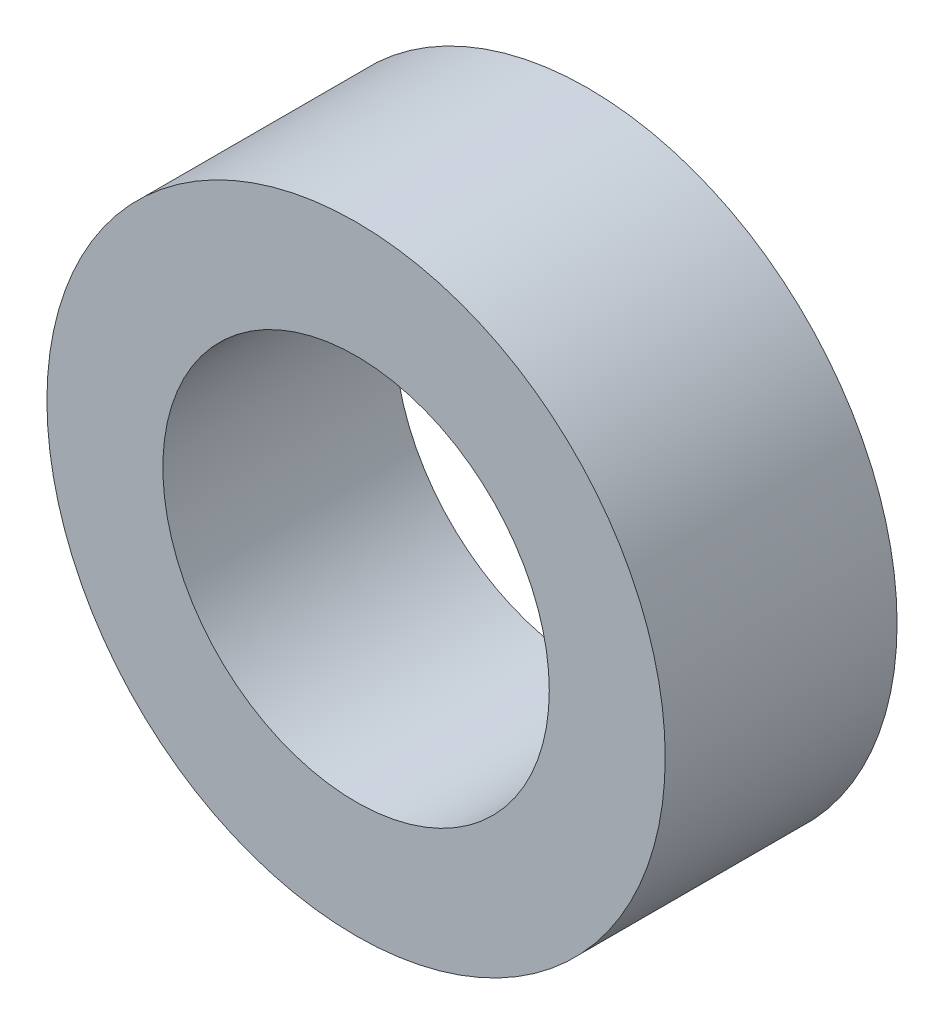
ISO-10303-21;
HEADER;
FILE_DESCRIPTION(('STEP AP214'),'2;1');
FILE_NAME('part.step','',(''),(''),'','','');
FILE_SCHEMA(('AUTOMOTIVE_DESIGN { 1 0 10303 214 1 1 1 1 }'));
ENDSEC;
DATA;
#1=APPLICATION_CONTEXT('core data for automotive mechanical design processes');
#2=APPLICATION_PROTOCOL_DEFINITION('international standard','automotive_design',2000,#1);
#3=PRODUCT_CONTEXT('',#1,'mechanical');
#4=PRODUCT('Part','Part','',(#3));
#5=PRODUCT_RELATED_PRODUCT_CATEGORY('part','',(#4));
#6=PRODUCT_DEFINITION_FORMATION('','',#4);
#7=PRODUCT_DEFINITION_CONTEXT('part definition',#1,'design');
#8=PRODUCT_DEFINITION('design','',#6,#7);
#9=PRODUCT_DEFINITION_SHAPE('','',#8);
#10=(LENGTH_UNIT() NAMED_UNIT(*) SI_UNIT(.MILLI.,.METRE.));
#11=(NAMED_UNIT(*) PLANE_ANGLE_UNIT() SI_UNIT($,.RADIAN.));
#12=(NAMED_UNIT(*) SI_UNIT($,.STERADIAN.) SOLID_ANGLE_UNIT());
#13=UNCERTAINTY_MEASURE_WITH_UNIT(LENGTH_MEASURE(1.E-05),#10,'distance_accuracy_value','');
#14=(GEOMETRIC_REPRESENTATION_CONTEXT(3) GLOBAL_UNCERTAINTY_ASSIGNED_CONTEXT((#13)) GLOBAL_UNIT_ASSIGNED_CONTEXT((#10,
#11,#12)) REPRESENTATION_CONTEXT('',''));
#15=CARTESIAN_POINT('',(0.,0.,0.));
#16=DIRECTION('',(0.,0.,1.));
#17=DIRECTION('',(1.,0.,0.));
#18=AXIS2_PLACEMENT_3D('',#15,#16,#17);
#19=CARTESIAN_POINT('',(0.,0.,6.));
#20=DIRECTION('',(0.,0.,1.));
#21=DIRECTION('',(1.,0.,0.));
#22=AXIS2_PLACEMENT_3D('',#19,#20,#21);
#23=PLANE('',#22);
#24=CARTESIAN_POINT('',(0.,0.,6.));
#25=DIRECTION('',(0.,0.,1.));
#26=DIRECTION('',(1.,0.,0.));
#27=AXIS2_PLACEMENT_3D('',#24,#25,#26);
#28=CIRCLE('',#27,8.);
#29=CARTESIAN_POINT('',(8.,0.,6.));
#30=VERTEX_POINT('',#29);
#31=EDGE_CURVE('E10',#30,#30,#28,.T.);
#32=ORIENTED_EDGE('',*,*,#31,.T.);
#33=EDGE_LOOP('',(#32));
#34=FACE_BOUND('',#33,.T.);
#35=CARTESIAN_POINT('',(0.,0.,6.));
#36=DIRECTION('',(0.,0.,1.));
#37=DIRECTION('',(1.,0.,0.));
#38=AXIS2_PLACEMENT_3D('',#35,#36,#37);
#39=CIRCLE('',#38,5.);
#40=CARTESIAN_POINT('',(5.,0.,6.));
#41=VERTEX_POINT('',#40);
#42=EDGE_CURVE('E44',#41,#41,#39,.T.);
#43=ORIENTED_EDGE('',*,*,#42,.F.);
#44=EDGE_LOOP('',(#43));
#45=FACE_BOUND('',#44,.T.);
#46=ADVANCED_FACE('F33',(#34,#45),#23,.T.);
#47=CARTESIAN_POINT('',(0.,0.,0.));
#48=DIRECTION('',(0.,0.,1.));
#49=DIRECTION('',(1.,0.,0.));
#50=AXIS2_PLACEMENT_3D('',#47,#48,#49);
#51=PLANE('',#50);
#52=CARTESIAN_POINT('',(0.,0.,0.));
#53=DIRECTION('',(0.,0.,1.));
#54=DIRECTION('',(1.,0.,0.));
#55=AXIS2_PLACEMENT_3D('',#52,#53,#54);
#56=CIRCLE('',#55,8.);
#57=CARTESIAN_POINT('',(8.,0.,0.));
#58=VERTEX_POINT('',#57);
#59=EDGE_CURVE('E37',#58,#58,#56,.T.);
#60=ORIENTED_EDGE('',*,*,#59,.F.);
#61=EDGE_LOOP('',(#60));
#62=FACE_BOUND('',#61,.T.);
#63=CARTESIAN_POINT('',(0.,0.,0.));
#64=DIRECTION('',(0.,0.,1.));
#65=DIRECTION('',(1.,0.,0.));
#66=AXIS2_PLACEMENT_3D('',#63,#64,#65);
#67=CIRCLE('',#66,5.);
#68=CARTESIAN_POINT('',(5.,0.,0.));
#69=VERTEX_POINT('',#68);
#70=EDGE_CURVE('E46',#69,#69,#67,.T.);
#71=ORIENTED_EDGE('',*,*,#70,.T.);
#72=EDGE_LOOP('',(#71));
#73=FACE_BOUND('',#72,.T.);
#74=ADVANCED_FACE('F56',(#62,#73),#51,.F.);
#75=CARTESIAN_POINT('',(0.,0.,6.));
#76=DIRECTION('',(0.,0.,-1.));
#77=DIRECTION('',(-1.,0.,0.));
#78=AXIS2_PLACEMENT_3D('',#75,#76,#77);
#79=CYLINDRICAL_SURFACE('',#78,8.);
#80=ORIENTED_EDGE('',*,*,#31,.F.);
#81=EDGE_LOOP('',(#80));
#82=FACE_BOUND('',#81,.T.);
#83=ORIENTED_EDGE('',*,*,#59,.T.);
#84=EDGE_LOOP('',(#83));
#85=FACE_BOUND('',#84,.T.);
#86=ADVANCED_FACE('F35',(#82,#85),#79,.T.);
#87=CARTESIAN_POINT('',(0.,0.,6.));
#88=DIRECTION('',(0.,0.,-1.));
#89=DIRECTION('',(-1.,0.,0.));
#90=AXIS2_PLACEMENT_3D('',#87,#88,#89);
#91=CYLINDRICAL_SURFACE('',#90,5.);
#92=ORIENTED_EDGE('',*,*,#42,.T.);
#93=EDGE_LOOP('',(#92));
#94=FACE_BOUND('',#93,.T.);
#95=ORIENTED_EDGE('',*,*,#70,.F.);
#96=EDGE_LOOP('',(#95));
#97=FACE_BOUND('',#96,.T.);
#98=ADVANCED_FACE('F52',(#94,#97),#91,.F.);
#99=CLOSED_SHELL('',(#46,#74,#86,#98));
#100=MANIFOLD_SOLID_BREP('B2',#99);
#101=ADVANCED_BREP_SHAPE_REPRESENTATION('',(#18,#100),#14);
#102=SHAPE_DEFINITION_REPRESENTATION(#9,#101);
ENDSEC;
END-ISO-10303-21;
